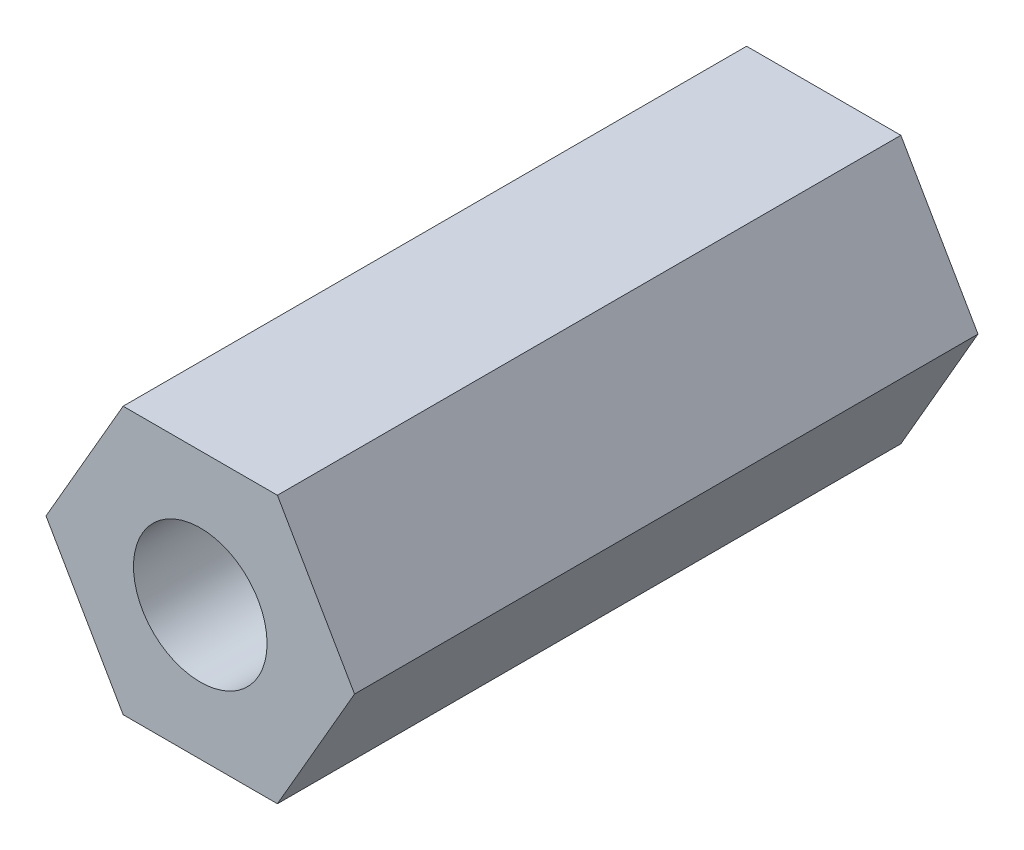
ISO-10303-21;
HEADER;
FILE_DESCRIPTION(('STEP AP214'),'2;1');
FILE_NAME('part.step','',(''),(''),'','','');
FILE_SCHEMA(('AUTOMOTIVE_DESIGN { 1 0 10303 214 1 1 1 1 }'));
ENDSEC;
DATA;
#1=APPLICATION_CONTEXT('core data for automotive mechanical design processes');
#2=APPLICATION_PROTOCOL_DEFINITION('international standard','automotive_design',2000,#1);
#3=PRODUCT_CONTEXT('',#1,'mechanical');
#4=PRODUCT('Part','Part','',(#3));
#5=PRODUCT_RELATED_PRODUCT_CATEGORY('part','',(#4));
#6=PRODUCT_DEFINITION_FORMATION('','',#4);
#7=PRODUCT_DEFINITION_CONTEXT('part definition',#1,'design');
#8=PRODUCT_DEFINITION('design','',#6,#7);
#9=PRODUCT_DEFINITION_SHAPE('','',#8);
#10=(LENGTH_UNIT() NAMED_UNIT(*) SI_UNIT(.MILLI.,.METRE.));
#11=(NAMED_UNIT(*) PLANE_ANGLE_UNIT() SI_UNIT($,.RADIAN.));
#12=(NAMED_UNIT(*) SI_UNIT($,.STERADIAN.) SOLID_ANGLE_UNIT());
#13=UNCERTAINTY_MEASURE_WITH_UNIT(LENGTH_MEASURE(1.E-05),#10,'distance_accuracy_value','');
#14=(GEOMETRIC_REPRESENTATION_CONTEXT(3) GLOBAL_UNCERTAINTY_ASSIGNED_CONTEXT((#13)) GLOBAL_UNIT_ASSIGNED_CONTEXT((#10,
#11,#12)) REPRESENTATION_CONTEXT('',''));
#15=CARTESIAN_POINT('',(0.,0.,0.));
#16=DIRECTION('',(0.,0.,1.));
#17=DIRECTION('',(1.,0.,0.));
#18=AXIS2_PLACEMENT_3D('',#15,#16,#17);
#19=CARTESIAN_POINT('',(-1.73205080756888,-3.,13.));
#20=DIRECTION('',(0.866025403784438,-0.5,0.));
#21=DIRECTION('',(0.5,0.866025403784439,0.));
#22=AXIS2_PLACEMENT_3D('',#19,#20,#21);
#23=PLANE('',#22);
#24=DIRECTION('',(0.,0.,-1.));
#25=VECTOR('',#24,1.);
#26=CARTESIAN_POINT('',(0.,0.,13.));
#27=LINE('',#26,#25);
#28=CARTESIAN_POINT('',(0.,0.,13.));
#29=VERTEX_POINT('',#28);
#30=CARTESIAN_POINT('',(0.,0.,-1.));
#31=VERTEX_POINT('',#30);
#32=EDGE_CURVE('E112',#29,#31,#27,.T.);
#33=ORIENTED_EDGE('',*,*,#32,.T.);
#34=DIRECTION('',(-0.5,-0.866025403784439,0.));
#35=VECTOR('',#34,1.);
#36=CARTESIAN_POINT('',(-1.73205080756888,-3.,-1.));
#37=LINE('',#36,#35);
#38=CARTESIAN_POINT('',(-1.73205080756888,-3.,-1.));
#39=VERTEX_POINT('',#38);
#40=EDGE_CURVE('E106',#31,#39,#37,.T.);
#41=ORIENTED_EDGE('',*,*,#40,.T.);
#42=DIRECTION('',(0.,0.,-1.));
#43=VECTOR('',#42,1.);
#44=CARTESIAN_POINT('',(-1.73205080756888,-3.,13.));
#45=LINE('',#44,#43);
#46=CARTESIAN_POINT('',(-1.73205080756888,-3.,13.));
#47=VERTEX_POINT('',#46);
#48=EDGE_CURVE('E11',#47,#39,#45,.T.);
#49=ORIENTED_EDGE('',*,*,#48,.F.);
#50=DIRECTION('',(-0.5,-0.866025403784439,0.));
#51=VECTOR('',#50,1.);
#52=CARTESIAN_POINT('',(-1.73205080756888,-3.,13.));
#53=LINE('',#52,#51);
#54=EDGE_CURVE('E128',#29,#47,#53,.T.);
#55=ORIENTED_EDGE('',*,*,#54,.F.);
#56=EDGE_LOOP('',(#33,#41,#49,#55));
#57=FACE_BOUND('',#56,.T.);
#58=ADVANCED_FACE('F41',(#57),#23,.F.);
#59=CARTESIAN_POINT('',(0.,-6.,13.));
#60=DIRECTION('',(0.866025403784439,0.5,0.));
#61=DIRECTION('',(-0.5,0.866025403784439,0.));
#62=AXIS2_PLACEMENT_3D('',#59,#60,#61);
#63=PLANE('',#62);
#64=ORIENTED_EDGE('',*,*,#48,.T.);
#65=DIRECTION('',(0.5,-0.866025403784439,0.));
#66=VECTOR('',#65,1.);
#67=CARTESIAN_POINT('',(0.,-6.,-1.));
#68=LINE('',#67,#66);
#69=CARTESIAN_POINT('',(0.,-6.,-1.));
#70=VERTEX_POINT('',#69);
#71=EDGE_CURVE('E96',#39,#70,#68,.T.);
#72=ORIENTED_EDGE('',*,*,#71,.T.);
#73=DIRECTION('',(0.,0.,-1.));
#74=VECTOR('',#73,1.);
#75=CARTESIAN_POINT('',(0.,-6.,13.));
#76=LINE('',#75,#74);
#77=CARTESIAN_POINT('',(0.,-6.,13.));
#78=VERTEX_POINT('',#77);
#79=EDGE_CURVE('E49',#78,#70,#76,.T.);
#80=ORIENTED_EDGE('',*,*,#79,.F.);
#81=DIRECTION('',(0.5,-0.866025403784439,0.));
#82=VECTOR('',#81,1.);
#83=CARTESIAN_POINT('',(0.,-6.,13.));
#84=LINE('',#83,#82);
#85=EDGE_CURVE('E97',#47,#78,#84,.T.);
#86=ORIENTED_EDGE('',*,*,#85,.F.);
#87=EDGE_LOOP('',(#64,#72,#80,#86));
#88=FACE_BOUND('',#87,.T.);
#89=ADVANCED_FACE('F94',(#88),#63,.F.);
#90=CARTESIAN_POINT('',(3.46410161513775,-6.,13.));
#91=DIRECTION('',(0.,1.,0.));
#92=DIRECTION('',(0.,0.,1.));
#93=AXIS2_PLACEMENT_3D('',#90,#91,#92);
#94=PLANE('',#93);
#95=ORIENTED_EDGE('',*,*,#79,.T.);
#96=DIRECTION('',(1.,0.,0.));
#97=VECTOR('',#96,1.);
#98=CARTESIAN_POINT('',(3.46410161513775,-6.,-1.));
#99=LINE('',#98,#97);
#100=CARTESIAN_POINT('',(3.46410161513775,-6.,-1.));
#101=VERTEX_POINT('',#100);
#102=EDGE_CURVE('E110',#70,#101,#99,.T.);
#103=ORIENTED_EDGE('',*,*,#102,.T.);
#104=DIRECTION('',(0.,0.,-1.));
#105=VECTOR('',#104,1.);
#106=CARTESIAN_POINT('',(3.46410161513775,-6.,13.));
#107=LINE('',#106,#105);
#108=CARTESIAN_POINT('',(3.46410161513775,-6.,13.));
#109=VERTEX_POINT('',#108);
#110=EDGE_CURVE('E142',#109,#101,#107,.T.);
#111=ORIENTED_EDGE('',*,*,#110,.F.);
#112=DIRECTION('',(1.,0.,0.));
#113=VECTOR('',#112,1.);
#114=CARTESIAN_POINT('',(3.46410161513775,-6.,13.));
#115=LINE('',#114,#113);
#116=EDGE_CURVE('E131',#78,#109,#115,.T.);
#117=ORIENTED_EDGE('',*,*,#116,.F.);
#118=EDGE_LOOP('',(#95,#103,#111,#117));
#119=FACE_BOUND('',#118,.T.);
#120=ADVANCED_FACE('F146',(#119),#94,.F.);
#121=CARTESIAN_POINT('',(5.19615242270663,-3.,13.));
#122=DIRECTION('',(-0.866025403784439,0.5,0.));
#123=DIRECTION('',(-0.5,-0.866025403784439,0.));
#124=AXIS2_PLACEMENT_3D('',#121,#122,#123);
#125=PLANE('',#124);
#126=ORIENTED_EDGE('',*,*,#110,.T.);
#127=DIRECTION('',(0.5,0.866025403784439,0.));
#128=VECTOR('',#127,1.);
#129=CARTESIAN_POINT('',(5.19615242270663,-3.,-1.));
#130=LINE('',#129,#128);
#131=CARTESIAN_POINT('',(5.19615242270663,-3.,-1.));
#132=VERTEX_POINT('',#131);
#133=EDGE_CURVE('E117',#101,#132,#130,.T.);
#134=ORIENTED_EDGE('',*,*,#133,.T.);
#135=DIRECTION('',(0.,0.,-1.));
#136=VECTOR('',#135,1.);
#137=CARTESIAN_POINT('',(5.19615242270663,-3.,13.));
#138=LINE('',#137,#136);
#139=CARTESIAN_POINT('',(5.19615242270663,-3.,13.));
#140=VERTEX_POINT('',#139);
#141=EDGE_CURVE('E140',#140,#132,#138,.T.);
#142=ORIENTED_EDGE('',*,*,#141,.F.);
#143=DIRECTION('',(0.5,0.866025403784439,0.));
#144=VECTOR('',#143,1.);
#145=CARTESIAN_POINT('',(5.19615242270663,-3.,13.));
#146=LINE('',#145,#144);
#147=EDGE_CURVE('E133',#109,#140,#146,.T.);
#148=ORIENTED_EDGE('',*,*,#147,.F.);
#149=EDGE_LOOP('',(#126,#134,#142,#148));
#150=FACE_BOUND('',#149,.T.);
#151=ADVANCED_FACE('F152',(#150),#125,.F.);
#152=CARTESIAN_POINT('',(3.46410161513775,0.,13.));
#153=DIRECTION('',(-0.866025403784439,-0.5,0.));
#154=DIRECTION('',(0.5,-0.866025403784439,0.));
#155=AXIS2_PLACEMENT_3D('',#152,#153,#154);
#156=PLANE('',#155);
#157=ORIENTED_EDGE('',*,*,#141,.T.);
#158=DIRECTION('',(-0.5,0.866025403784439,0.));
#159=VECTOR('',#158,1.);
#160=CARTESIAN_POINT('',(3.46410161513775,0.,-1.));
#161=LINE('',#160,#159);
#162=CARTESIAN_POINT('',(3.46410161513775,0.,-1.));
#163=VERTEX_POINT('',#162);
#164=EDGE_CURVE('E120',#132,#163,#161,.T.);
#165=ORIENTED_EDGE('',*,*,#164,.T.);
#166=DIRECTION('',(0.,0.,-1.));
#167=VECTOR('',#166,1.);
#168=CARTESIAN_POINT('',(3.46410161513775,0.,13.));
#169=LINE('',#168,#167);
#170=CARTESIAN_POINT('',(3.46410161513775,0.,13.));
#171=VERTEX_POINT('',#170);
#172=EDGE_CURVE('E138',#171,#163,#169,.T.);
#173=ORIENTED_EDGE('',*,*,#172,.F.);
#174=DIRECTION('',(-0.5,0.866025403784439,0.));
#175=VECTOR('',#174,1.);
#176=CARTESIAN_POINT('',(3.46410161513775,0.,13.));
#177=LINE('',#176,#175);
#178=EDGE_CURVE('E61',#140,#171,#177,.T.);
#179=ORIENTED_EDGE('',*,*,#178,.F.);
#180=EDGE_LOOP('',(#157,#165,#173,#179));
#181=FACE_BOUND('',#180,.T.);
#182=ADVANCED_FACE('F155',(#181),#156,.F.);
#183=CARTESIAN_POINT('',(0.,0.,13.));
#184=DIRECTION('',(0.,-1.,0.));
#185=DIRECTION('',(1.,0.,0.));
#186=AXIS2_PLACEMENT_3D('',#183,#184,#185);
#187=PLANE('',#186);
#188=ORIENTED_EDGE('',*,*,#172,.T.);
#189=DIRECTION('',(-1.,0.,0.));
#190=VECTOR('',#189,1.);
#191=CARTESIAN_POINT('',(0.,0.,-1.));
#192=LINE('',#191,#190);
#193=EDGE_CURVE('E123',#163,#31,#192,.T.);
#194=ORIENTED_EDGE('',*,*,#193,.T.);
#195=ORIENTED_EDGE('',*,*,#32,.F.);
#196=DIRECTION('',(-1.,0.,0.));
#197=VECTOR('',#196,1.);
#198=CARTESIAN_POINT('',(0.,0.,13.));
#199=LINE('',#198,#197);
#200=EDGE_CURVE('E56',#171,#29,#199,.T.);
#201=ORIENTED_EDGE('',*,*,#200,.F.);
#202=EDGE_LOOP('',(#188,#194,#195,#201));
#203=FACE_BOUND('',#202,.T.);
#204=ADVANCED_FACE('F157',(#203),#187,.F.);
#205=CARTESIAN_POINT('',(0.,0.,13.));
#206=DIRECTION('',(0.,0.,-1.));
#207=DIRECTION('',(-1.,0.,0.));
#208=AXIS2_PLACEMENT_3D('',#205,#206,#207);
#209=PLANE('',#208);
#210=CARTESIAN_POINT('',(1.73205080756888,-3.,13.));
#211=DIRECTION('',(0.,0.,1.));
#212=DIRECTION('',(1.,0.,0.));
#213=AXIS2_PLACEMENT_3D('',#210,#211,#212);
#214=CIRCLE('',#213,1.5);
#215=CARTESIAN_POINT('',(3.23205080756888,-3.,13.));
#216=VERTEX_POINT('',#215);
#217=EDGE_CURVE('E125',#216,#216,#214,.T.);
#218=ORIENTED_EDGE('',*,*,#217,.F.);
#219=EDGE_LOOP('',(#218));
#220=FACE_BOUND('',#219,.T.);
#221=ORIENTED_EDGE('',*,*,#54,.T.);
#222=ORIENTED_EDGE('',*,*,#85,.T.);
#223=ORIENTED_EDGE('',*,*,#116,.T.);
#224=ORIENTED_EDGE('',*,*,#147,.T.);
#225=ORIENTED_EDGE('',*,*,#178,.T.);
#226=ORIENTED_EDGE('',*,*,#200,.T.);
#227=EDGE_LOOP('',(#221,#222,#223,#224,#225,#226));
#228=FACE_BOUND('',#227,.T.);
#229=ADVANCED_FACE('F149',(#220,#228),#209,.F.);
#230=CARTESIAN_POINT('',(1.73205080756888,-3.,0.));
#231=DIRECTION('',(0.,0.,1.));
#232=DIRECTION('',(1.,0.,0.));
#233=AXIS2_PLACEMENT_3D('',#230,#231,#232);
#234=CYLINDRICAL_SURFACE('',#233,1.5);
#235=CARTESIAN_POINT('',(1.73205080756888,-3.,-1.));
#236=DIRECTION('',(0.,0.,-1.));
#237=DIRECTION('',(-1.,0.,0.));
#238=AXIS2_PLACEMENT_3D('',#235,#236,#237);
#239=CIRCLE('',#238,1.5);
#240=CARTESIAN_POINT('',(3.23205080756888,-3.,-1.));
#241=VERTEX_POINT('',#240);
#242=EDGE_CURVE('E44',#241,#241,#239,.T.);
#243=CARTESIAN_POINT('',(3.23205080756888,-3.,13.));
#244=CARTESIAN_POINT('',(3.23205080756888,-3.,12.8541666666667));
#245=CARTESIAN_POINT('',(3.23205080756888,-3.,12.7083333333333));
#246=CARTESIAN_POINT('',(3.23205080756888,-3.,12.4166666666667));
#247=CARTESIAN_POINT('',(3.23205080756888,-3.,12.2708333333333));
#248=CARTESIAN_POINT('',(3.23205080756888,-3.,11.9791666666667));
#249=CARTESIAN_POINT('',(3.23205080756888,-3.,11.8333333333333));
#250=CARTESIAN_POINT('',(3.23205080756888,-3.,11.5416666666667));
#251=CARTESIAN_POINT('',(3.23205080756888,-3.,11.3958333333333));
#252=CARTESIAN_POINT('',(3.23205080756888,-3.,11.1041666666667));
#253=CARTESIAN_POINT('',(3.23205080756888,-3.,10.9583333333333));
#254=CARTESIAN_POINT('',(3.23205080756888,-3.,10.6666666666667));
#255=CARTESIAN_POINT('',(3.23205080756888,-3.,10.5208333333333));
#256=CARTESIAN_POINT('',(3.23205080756888,-3.,10.2291666666667));
#257=CARTESIAN_POINT('',(3.23205080756888,-3.,10.0833333333333));
#258=CARTESIAN_POINT('',(3.23205080756888,-3.,9.79166666666667));
#259=CARTESIAN_POINT('',(3.23205080756888,-3.,9.64583333333333));
#260=CARTESIAN_POINT('',(3.23205080756888,-3.,9.35416666666667));
#261=CARTESIAN_POINT('',(3.23205080756888,-3.,9.20833333333333));
#262=CARTESIAN_POINT('',(3.23205080756888,-3.,8.91666666666667));
#263=CARTESIAN_POINT('',(3.23205080756888,-3.,8.77083333333333));
#264=CARTESIAN_POINT('',(3.23205080756888,-3.,8.47916666666667));
#265=CARTESIAN_POINT('',(3.23205080756888,-3.,8.33333333333333));
#266=CARTESIAN_POINT('',(3.23205080756888,-3.,8.04166666666667));
#267=CARTESIAN_POINT('',(3.23205080756888,-3.,7.89583333333333));
#268=CARTESIAN_POINT('',(3.23205080756888,-3.,7.60416666666667));
#269=CARTESIAN_POINT('',(3.23205080756888,-3.,7.45833333333333));
#270=CARTESIAN_POINT('',(3.23205080756888,-3.,7.16666666666667));
#271=CARTESIAN_POINT('',(3.23205080756888,-3.,7.02083333333333));
#272=CARTESIAN_POINT('',(3.23205080756888,-3.,6.72916666666667));
#273=CARTESIAN_POINT('',(3.23205080756888,-3.,6.58333333333333));
#274=CARTESIAN_POINT('',(3.23205080756888,-3.,6.29166666666667));
#275=CARTESIAN_POINT('',(3.23205080756888,-3.,6.14583333333333));
#276=CARTESIAN_POINT('',(3.23205080756888,-3.,5.85416666666667));
#277=CARTESIAN_POINT('',(3.23205080756888,-3.,5.70833333333333));
#278=CARTESIAN_POINT('',(3.23205080756888,-3.,5.41666666666667));
#279=CARTESIAN_POINT('',(3.23205080756888,-3.,5.27083333333333));
#280=CARTESIAN_POINT('',(3.23205080756888,-3.,4.97916666666667));
#281=CARTESIAN_POINT('',(3.23205080756888,-3.,4.83333333333333));
#282=CARTESIAN_POINT('',(3.23205080756888,-3.,4.54166666666667));
#283=CARTESIAN_POINT('',(3.23205080756888,-3.,4.39583333333333));
#284=CARTESIAN_POINT('',(3.23205080756888,-3.,4.10416666666667));
#285=CARTESIAN_POINT('',(3.23205080756888,-3.,3.95833333333333));
#286=CARTESIAN_POINT('',(3.23205080756888,-3.,3.66666666666667));
#287=CARTESIAN_POINT('',(3.23205080756888,-3.,3.52083333333333));
#288=CARTESIAN_POINT('',(3.23205080756888,-3.,3.22916666666667));
#289=CARTESIAN_POINT('',(3.23205080756888,-3.,3.08333333333333));
#290=CARTESIAN_POINT('',(3.23205080756888,-3.,2.79166666666667));
#291=CARTESIAN_POINT('',(3.23205080756888,-3.,2.64583333333333));
#292=CARTESIAN_POINT('',(3.23205080756888,-3.,2.35416666666667));
#293=CARTESIAN_POINT('',(3.23205080756888,-3.,2.20833333333333));
#294=CARTESIAN_POINT('',(3.23205080756888,-3.,1.91666666666667));
#295=CARTESIAN_POINT('',(3.23205080756888,-3.,1.77083333333333));
#296=CARTESIAN_POINT('',(3.23205080756888,-3.,1.47916666666667));
#297=CARTESIAN_POINT('',(3.23205080756888,-3.,1.33333333333333));
#298=CARTESIAN_POINT('',(3.23205080756888,-3.,1.04166666666667));
#299=CARTESIAN_POINT('',(3.23205080756888,-3.,0.895833333333332));
#300=CARTESIAN_POINT('',(3.23205080756888,-3.,0.604166666666665));
#301=CARTESIAN_POINT('',(3.23205080756888,-3.,0.458333333333332));
#302=CARTESIAN_POINT('',(3.23205080756888,-3.,0.166666666666666));
#303=CARTESIAN_POINT('',(3.23205080756888,-3.,0.0208333333333327));
#304=CARTESIAN_POINT('',(3.23205080756888,-3.,-0.270833333333333));
#305=CARTESIAN_POINT('',(3.23205080756888,-3.,-0.416666666666667));
#306=CARTESIAN_POINT('',(3.23205080756888,-3.,-0.708333333333334));
#307=CARTESIAN_POINT('',(3.23205080756888,-3.,-0.854166666666667));
#308=CARTESIAN_POINT('',(3.23205080756888,-3.,-1.));
#309=B_SPLINE_CURVE_WITH_KNOTS('',3,(#243,#244,#245,#246,#247,#248,#249,#250,#251,#252,#253,
#254,#255,#256,#257,#258,#259,#260,#261,#262,#263,#264,#265,#266,#267,#268,#269,#270,#271,#272,
#273,#274,#275,#276,#277,#278,#279,#280,#281,#282,#283,#284,#285,#286,#287,#288,#289,#290,#291,
#292,#293,#294,#295,#296,#297,#298,#299,#300,#301,#302,#303,#304,#305,#306,#307,#308),
.UNSPECIFIED.,.F.,.F.,(4,2,2,2,2,2,2,2,2,2,2,2,2,2,2,2,2,2,2,2,2,2,2,2,2,2,2,2,2,2,2,2,4),(0.,
0.4375,0.875000000000001,1.3125,1.75,2.1875,2.625,3.0625,3.5,3.9375,4.375,4.8125,5.25,5.6875,
6.125,6.5625,7.,7.4375,7.875,8.3125,8.75,9.1875,9.625,10.0625,10.5,10.9375,11.375,11.8125,12.25,
12.6875,13.125,13.5625,14.),.UNSPECIFIED.);
#310=EDGE_CURVE('BSEAM165',#216,#241,#309,.T.);
#311=ORIENTED_EDGE('',*,*,#217,.T.);
#312=ORIENTED_EDGE('',*,*,#242,.T.);
#313=ORIENTED_EDGE('',*,*,#310,.T.);
#314=ORIENTED_EDGE('',*,*,#310,.F.);
#315=EDGE_LOOP('',(#311,#313,#312,#314));
#316=FACE_BOUND('',#315,.T.);
#317=ADVANCED_FACE('F165',(#316),#234,.F.);
#318=CARTESIAN_POINT('',(0.,0.,-1.));
#319=DIRECTION('',(0.,0.,-1.));
#320=DIRECTION('',(-1.,0.,0.));
#321=AXIS2_PLACEMENT_3D('',#318,#319,#320);
#322=PLANE('',#321);
#323=ORIENTED_EDGE('',*,*,#242,.F.);
#324=EDGE_LOOP('',(#323));
#325=FACE_BOUND('',#324,.T.);
#326=ORIENTED_EDGE('',*,*,#40,.F.);
#327=ORIENTED_EDGE('',*,*,#193,.F.);
#328=ORIENTED_EDGE('',*,*,#164,.F.);
#329=ORIENTED_EDGE('',*,*,#133,.F.);
#330=ORIENTED_EDGE('',*,*,#102,.F.);
#331=ORIENTED_EDGE('',*,*,#71,.F.);
#332=EDGE_LOOP('',(#326,#327,#328,#329,#330,#331));
#333=FACE_BOUND('',#332,.T.);
#334=ADVANCED_FACE('F104',(#325,#333),#322,.T.);
#335=CLOSED_SHELL('',(#58,#89,#120,#151,#182,#204,#229,#317,#334));
#336=MANIFOLD_SOLID_BREP('B2',#335);
#337=ADVANCED_BREP_SHAPE_REPRESENTATION('',(#18,#336),#14);
#338=SHAPE_DEFINITION_REPRESENTATION(#9,#337);
ENDSEC;
END-ISO-10303-21;
